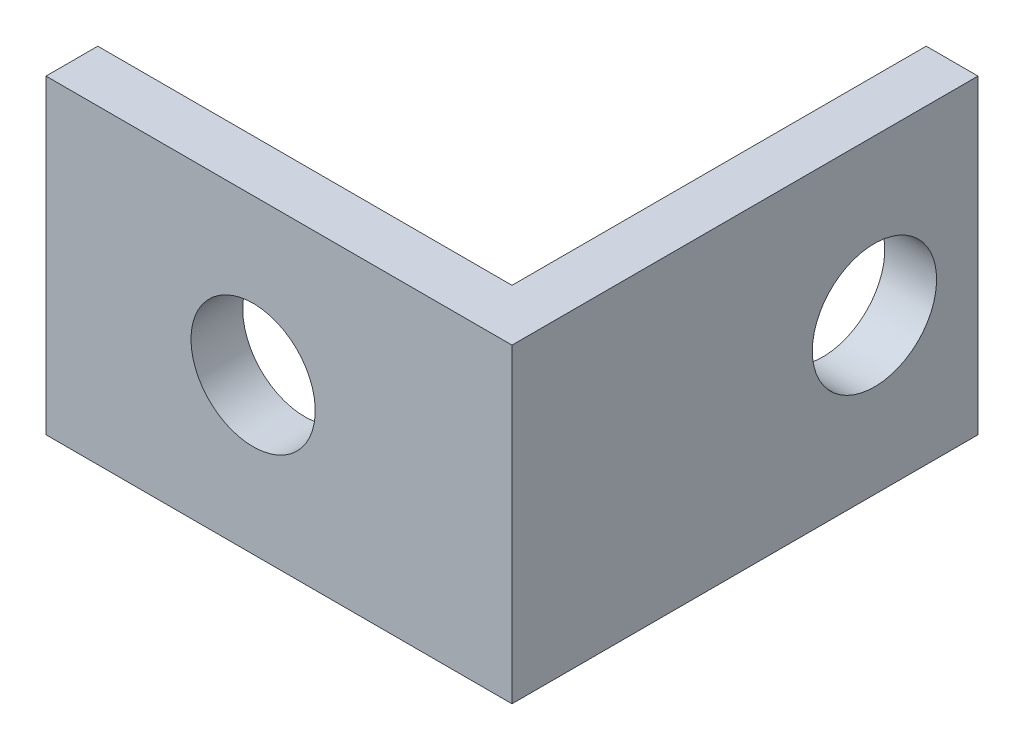
ISO-10303-21;
HEADER;
FILE_DESCRIPTION(('STEP AP214'),'2;1');
FILE_NAME('part.step','',(''),(''),'','','');
FILE_SCHEMA(('AUTOMOTIVE_DESIGN { 1 0 10303 214 1 1 1 1 }'));
ENDSEC;
DATA;
#1=APPLICATION_CONTEXT('core data for automotive mechanical design processes');
#2=APPLICATION_PROTOCOL_DEFINITION('international standard','automotive_design',2000,#1);
#3=PRODUCT_CONTEXT('',#1,'mechanical');
#4=PRODUCT('Part','Part','',(#3));
#5=PRODUCT_RELATED_PRODUCT_CATEGORY('part','',(#4));
#6=PRODUCT_DEFINITION_FORMATION('','',#4);
#7=PRODUCT_DEFINITION_CONTEXT('part definition',#1,'design');
#8=PRODUCT_DEFINITION('design','',#6,#7);
#9=PRODUCT_DEFINITION_SHAPE('','',#8);
#10=(LENGTH_UNIT() NAMED_UNIT(*) SI_UNIT(.MILLI.,.METRE.));
#11=(NAMED_UNIT(*) PLANE_ANGLE_UNIT() SI_UNIT($,.RADIAN.));
#12=(NAMED_UNIT(*) SI_UNIT($,.STERADIAN.) SOLID_ANGLE_UNIT());
#13=UNCERTAINTY_MEASURE_WITH_UNIT(LENGTH_MEASURE(1.E-05),#10,'distance_accuracy_value','');
#14=(GEOMETRIC_REPRESENTATION_CONTEXT(3) GLOBAL_UNCERTAINTY_ASSIGNED_CONTEXT((#13)) GLOBAL_UNIT_ASSIGNED_CONTEXT((#10,
#11,#12)) REPRESENTATION_CONTEXT('',''));
#15=CARTESIAN_POINT('',(0.,0.,0.));
#16=DIRECTION('',(0.,0.,1.));
#17=DIRECTION('',(1.,0.,0.));
#18=AXIS2_PLACEMENT_3D('',#15,#16,#17);
#19=CARTESIAN_POINT('',(0.,15.,-2.5));
#20=DIRECTION('',(1.,0.,0.));
#21=DIRECTION('',(0.,0.,-1.));
#22=AXIS2_PLACEMENT_3D('',#19,#20,#21);
#23=PLANE('',#22);
#24=DIRECTION('',(0.,0.,1.));
#25=VECTOR('',#24,1.);
#26=CARTESIAN_POINT('',(0.,0.,-2.5));
#27=LINE('',#26,#25);
#28=CARTESIAN_POINT('',(0.,0.,-2.5));
#29=VERTEX_POINT('',#28);
#30=CARTESIAN_POINT('',(0.,0.,0.));
#31=VERTEX_POINT('',#30);
#32=EDGE_CURVE('E128',#29,#31,#27,.T.);
#33=ORIENTED_EDGE('',*,*,#32,.T.);
#34=DIRECTION('',(0.,-1.,0.));
#35=VECTOR('',#34,1.);
#36=CARTESIAN_POINT('',(0.,15.,0.));
#37=LINE('',#36,#35);
#38=CARTESIAN_POINT('',(0.,15.,0.));
#39=VERTEX_POINT('',#38);
#40=EDGE_CURVE('E11',#39,#31,#37,.T.);
#41=ORIENTED_EDGE('',*,*,#40,.F.);
#42=DIRECTION('',(0.,0.,1.));
#43=VECTOR('',#42,1.);
#44=CARTESIAN_POINT('',(0.,15.,-2.5));
#45=LINE('',#44,#43);
#46=CARTESIAN_POINT('',(0.,15.,-2.5));
#47=VERTEX_POINT('',#46);
#48=EDGE_CURVE('E145',#47,#39,#45,.T.);
#49=ORIENTED_EDGE('',*,*,#48,.F.);
#50=DIRECTION('',(0.,-1.,0.));
#51=VECTOR('',#50,1.);
#52=CARTESIAN_POINT('',(0.,15.,-2.5));
#53=LINE('',#52,#51);
#54=EDGE_CURVE('E124',#47,#29,#53,.T.);
#55=ORIENTED_EDGE('',*,*,#54,.T.);
#56=EDGE_LOOP('',(#33,#41,#49,#55));
#57=FACE_BOUND('',#56,.T.);
#58=ADVANCED_FACE('F39',(#57),#23,.F.);
#59=CARTESIAN_POINT('',(0.,15.,0.));
#60=DIRECTION('',(0.,0.,-1.));
#61=DIRECTION('',(-1.,0.,0.));
#62=AXIS2_PLACEMENT_3D('',#59,#60,#61);
#63=PLANE('',#62);
#64=CARTESIAN_POINT('',(10.,7.5,0.));
#65=DIRECTION('',(0.,0.,-1.));
#66=DIRECTION('',(-1.,0.,0.));
#67=AXIS2_PLACEMENT_3D('',#64,#65,#66);
#68=CIRCLE('',#67,3.);
#69=CARTESIAN_POINT('',(7.,7.5,0.));
#70=VERTEX_POINT('',#69);
#71=EDGE_CURVE('E133',#70,#70,#68,.T.);
#72=ORIENTED_EDGE('',*,*,#71,.T.);
#73=EDGE_LOOP('',(#72));
#74=FACE_BOUND('',#73,.T.);
#75=DIRECTION('',(1.,0.,0.));
#76=VECTOR('',#75,1.);
#77=CARTESIAN_POINT('',(0.,0.,0.));
#78=LINE('',#77,#76);
#79=CARTESIAN_POINT('',(22.5,0.,0.));
#80=VERTEX_POINT('',#79);
#81=EDGE_CURVE('E132',#31,#80,#78,.T.);
#82=ORIENTED_EDGE('',*,*,#81,.T.);
#83=DIRECTION('',(0.,-1.,0.));
#84=VECTOR('',#83,1.);
#85=CARTESIAN_POINT('',(22.5,15.,0.));
#86=LINE('',#85,#84);
#87=CARTESIAN_POINT('',(22.5,15.,0.));
#88=VERTEX_POINT('',#87);
#89=EDGE_CURVE('E48',#88,#80,#86,.T.);
#90=ORIENTED_EDGE('',*,*,#89,.F.);
#91=DIRECTION('',(1.,0.,0.));
#92=VECTOR('',#91,1.);
#93=CARTESIAN_POINT('',(0.,15.,0.));
#94=LINE('',#93,#92);
#95=EDGE_CURVE('E93',#39,#88,#94,.T.);
#96=ORIENTED_EDGE('',*,*,#95,.F.);
#97=ORIENTED_EDGE('',*,*,#40,.T.);
#98=EDGE_LOOP('',(#82,#90,#96,#97));
#99=FACE_BOUND('',#98,.T.);
#100=ADVANCED_FACE('F176',(#74,#99),#63,.F.);
#101=CARTESIAN_POINT('',(22.5,15.,0.));
#102=DIRECTION('',(-1.,0.,0.));
#103=DIRECTION('',(0.,0.,1.));
#104=AXIS2_PLACEMENT_3D('',#101,#102,#103);
#105=PLANE('',#104);
#106=CARTESIAN_POINT('',(22.5,7.5,-17.5));
#107=DIRECTION('',(-1.,0.,0.));
#108=DIRECTION('',(0.,0.,1.));
#109=AXIS2_PLACEMENT_3D('',#106,#107,#108);
#110=CIRCLE('',#109,3.);
#111=CARTESIAN_POINT('',(22.5,7.5,-14.5));
#112=VERTEX_POINT('',#111);
#113=EDGE_CURVE('E257',#112,#112,#110,.T.);
#114=ORIENTED_EDGE('',*,*,#113,.T.);
#115=EDGE_LOOP('',(#114));
#116=FACE_BOUND('',#115,.T.);
#117=DIRECTION('',(0.,0.,-1.));
#118=VECTOR('',#117,1.);
#119=CARTESIAN_POINT('',(22.5,0.,0.));
#120=LINE('',#119,#118);
#121=CARTESIAN_POINT('',(22.5,0.,-22.5));
#122=VERTEX_POINT('',#121);
#123=EDGE_CURVE('E136',#80,#122,#120,.T.);
#124=ORIENTED_EDGE('',*,*,#123,.T.);
#125=DIRECTION('',(0.,-1.,0.));
#126=VECTOR('',#125,1.);
#127=CARTESIAN_POINT('',(22.5,15.,-22.5));
#128=LINE('',#127,#126);
#129=CARTESIAN_POINT('',(22.5,15.,-22.5));
#130=VERTEX_POINT('',#129);
#131=EDGE_CURVE('E117',#130,#122,#128,.T.);
#132=ORIENTED_EDGE('',*,*,#131,.F.);
#133=DIRECTION('',(0.,0.,-1.));
#134=VECTOR('',#133,1.);
#135=CARTESIAN_POINT('',(22.5,15.,0.));
#136=LINE('',#135,#134);
#137=EDGE_CURVE('E106',#88,#130,#136,.T.);
#138=ORIENTED_EDGE('',*,*,#137,.F.);
#139=ORIENTED_EDGE('',*,*,#89,.T.);
#140=EDGE_LOOP('',(#124,#132,#138,#139));
#141=FACE_BOUND('',#140,.T.);
#142=ADVANCED_FACE('F155',(#116,#141),#105,.F.);
#143=CARTESIAN_POINT('',(22.5,15.,-22.5));
#144=DIRECTION('',(0.,0.,1.));
#145=DIRECTION('',(1.,0.,0.));
#146=AXIS2_PLACEMENT_3D('',#143,#144,#145);
#147=PLANE('',#146);
#148=DIRECTION('',(-1.,0.,0.));
#149=VECTOR('',#148,1.);
#150=CARTESIAN_POINT('',(22.5,0.,-22.5));
#151=LINE('',#150,#149);
#152=CARTESIAN_POINT('',(20.,0.,-22.5));
#153=VERTEX_POINT('',#152);
#154=EDGE_CURVE('E115',#122,#153,#151,.T.);
#155=ORIENTED_EDGE('',*,*,#154,.T.);
#156=DIRECTION('',(0.,-1.,0.));
#157=VECTOR('',#156,1.);
#158=CARTESIAN_POINT('',(20.,15.,-22.5));
#159=LINE('',#158,#157);
#160=CARTESIAN_POINT('',(20.,15.,-22.5));
#161=VERTEX_POINT('',#160);
#162=EDGE_CURVE('E112',#161,#153,#159,.T.);
#163=ORIENTED_EDGE('',*,*,#162,.F.);
#164=DIRECTION('',(-1.,0.,0.));
#165=VECTOR('',#164,1.);
#166=CARTESIAN_POINT('',(22.5,15.,-22.5));
#167=LINE('',#166,#165);
#168=EDGE_CURVE('E100',#130,#161,#167,.T.);
#169=ORIENTED_EDGE('',*,*,#168,.F.);
#170=ORIENTED_EDGE('',*,*,#131,.T.);
#171=EDGE_LOOP('',(#155,#163,#169,#170));
#172=FACE_BOUND('',#171,.T.);
#173=ADVANCED_FACE('F113',(#172),#147,.F.);
#174=CARTESIAN_POINT('',(20.,15.,-22.5));
#175=DIRECTION('',(1.,0.,0.));
#176=DIRECTION('',(0.,0.,-1.));
#177=AXIS2_PLACEMENT_3D('',#174,#175,#176);
#178=PLANE('',#177);
#179=CARTESIAN_POINT('',(20.,7.5,-17.5));
#180=DIRECTION('',(-1.,0.,0.));
#181=DIRECTION('',(0.,0.,1.));
#182=AXIS2_PLACEMENT_3D('',#179,#180,#181);
#183=CIRCLE('',#182,3.);
#184=CARTESIAN_POINT('',(20.,7.5,-14.5));
#185=VERTEX_POINT('',#184);
#186=EDGE_CURVE('E263',#185,#185,#183,.T.);
#187=ORIENTED_EDGE('',*,*,#186,.F.);
#188=EDGE_LOOP('',(#187));
#189=FACE_BOUND('',#188,.T.);
#190=DIRECTION('',(0.,0.,1.));
#191=VECTOR('',#190,1.);
#192=CARTESIAN_POINT('',(20.,0.,-22.5));
#193=LINE('',#192,#191);
#194=CARTESIAN_POINT('',(20.,0.,-2.5));
#195=VERTEX_POINT('',#194);
#196=EDGE_CURVE('E79',#153,#195,#193,.T.);
#197=ORIENTED_EDGE('',*,*,#196,.T.);
#198=DIRECTION('',(0.,-1.,0.));
#199=VECTOR('',#198,1.);
#200=CARTESIAN_POINT('',(20.,15.,-2.5));
#201=LINE('',#200,#199);
#202=CARTESIAN_POINT('',(20.,15.,-2.5));
#203=VERTEX_POINT('',#202);
#204=EDGE_CURVE('E118',#203,#195,#201,.T.);
#205=ORIENTED_EDGE('',*,*,#204,.F.);
#206=DIRECTION('',(0.,0.,1.));
#207=VECTOR('',#206,1.);
#208=CARTESIAN_POINT('',(20.,15.,-22.5));
#209=LINE('',#208,#207);
#210=EDGE_CURVE('E104',#161,#203,#209,.T.);
#211=ORIENTED_EDGE('',*,*,#210,.F.);
#212=ORIENTED_EDGE('',*,*,#162,.T.);
#213=EDGE_LOOP('',(#197,#205,#211,#212));
#214=FACE_BOUND('',#213,.T.);
#215=ADVANCED_FACE('F120',(#189,#214),#178,.F.);
#216=CARTESIAN_POINT('',(20.,15.,-2.5));
#217=DIRECTION('',(0.,0.,1.));
#218=DIRECTION('',(1.,0.,0.));
#219=AXIS2_PLACEMENT_3D('',#216,#217,#218);
#220=PLANE('',#219);
#221=CARTESIAN_POINT('',(10.,7.5,-2.5));
#222=DIRECTION('',(0.,0.,-1.));
#223=DIRECTION('',(-1.,0.,0.));
#224=AXIS2_PLACEMENT_3D('',#221,#222,#223);
#225=CIRCLE('',#224,3.);
#226=CARTESIAN_POINT('',(7.,7.5,-2.5));
#227=VERTEX_POINT('',#226);
#228=EDGE_CURVE('E255',#227,#227,#225,.T.);
#229=ORIENTED_EDGE('',*,*,#228,.F.);
#230=EDGE_LOOP('',(#229));
#231=FACE_BOUND('',#230,.T.);
#232=DIRECTION('',(-1.,0.,0.));
#233=VECTOR('',#232,1.);
#234=CARTESIAN_POINT('',(20.,0.,-2.5));
#235=LINE('',#234,#233);
#236=EDGE_CURVE('E85',#195,#29,#235,.T.);
#237=ORIENTED_EDGE('',*,*,#236,.T.);
#238=ORIENTED_EDGE('',*,*,#54,.F.);
#239=DIRECTION('',(-1.,0.,0.));
#240=VECTOR('',#239,1.);
#241=CARTESIAN_POINT('',(20.,15.,-2.5));
#242=LINE('',#241,#240);
#243=EDGE_CURVE('E56',#203,#47,#242,.T.);
#244=ORIENTED_EDGE('',*,*,#243,.F.);
#245=ORIENTED_EDGE('',*,*,#204,.T.);
#246=EDGE_LOOP('',(#237,#238,#244,#245));
#247=FACE_BOUND('',#246,.T.);
#248=ADVANCED_FACE('F162',(#231,#247),#220,.F.);
#249=CARTESIAN_POINT('',(0.,15.,0.));
#250=DIRECTION('',(0.,1.,0.));
#251=DIRECTION('',(0.,0.,1.));
#252=AXIS2_PLACEMENT_3D('',#249,#250,#251);
#253=PLANE('',#252);
#254=ORIENTED_EDGE('',*,*,#48,.T.);
#255=ORIENTED_EDGE('',*,*,#95,.T.);
#256=ORIENTED_EDGE('',*,*,#137,.T.);
#257=ORIENTED_EDGE('',*,*,#168,.T.);
#258=ORIENTED_EDGE('',*,*,#210,.T.);
#259=ORIENTED_EDGE('',*,*,#243,.T.);
#260=EDGE_LOOP('',(#254,#255,#256,#257,#258,#259));
#261=FACE_BOUND('',#260,.T.);
#262=ADVANCED_FACE('F102',(#261),#253,.T.);
#263=CARTESIAN_POINT('',(0.,0.,0.));
#264=DIRECTION('',(0.,1.,0.));
#265=DIRECTION('',(0.,0.,1.));
#266=AXIS2_PLACEMENT_3D('',#263,#264,#265);
#267=PLANE('',#266);
#268=ORIENTED_EDGE('',*,*,#32,.F.);
#269=ORIENTED_EDGE('',*,*,#236,.F.);
#270=ORIENTED_EDGE('',*,*,#196,.F.);
#271=ORIENTED_EDGE('',*,*,#154,.F.);
#272=ORIENTED_EDGE('',*,*,#123,.F.);
#273=ORIENTED_EDGE('',*,*,#81,.F.);
#274=EDGE_LOOP('',(#268,#269,#270,#271,#272,#273));
#275=FACE_BOUND('',#274,.T.);
#276=ADVANCED_FACE('F158',(#275),#267,.F.);
#277=CARTESIAN_POINT('',(10.,7.5,0.));
#278=DIRECTION('',(0.,0.,-1.));
#279=DIRECTION('',(-1.,0.,0.));
#280=AXIS2_PLACEMENT_3D('',#277,#278,#279);
#281=CYLINDRICAL_SURFACE('',#280,3.);
#282=ORIENTED_EDGE('',*,*,#71,.F.);
#283=EDGE_LOOP('',(#282));
#284=FACE_BOUND('',#283,.T.);
#285=ORIENTED_EDGE('',*,*,#228,.T.);
#286=EDGE_LOOP('',(#285));
#287=FACE_BOUND('',#286,.T.);
#288=ADVANCED_FACE('F211',(#284,#287),#281,.F.);
#289=CARTESIAN_POINT('',(22.5,7.5,-17.5));
#290=DIRECTION('',(-1.,0.,0.));
#291=DIRECTION('',(0.,0.,1.));
#292=AXIS2_PLACEMENT_3D('',#289,#290,#291);
#293=CYLINDRICAL_SURFACE('',#292,3.);
#294=ORIENTED_EDGE('',*,*,#113,.F.);
#295=EDGE_LOOP('',(#294));
#296=FACE_BOUND('',#295,.T.);
#297=ORIENTED_EDGE('',*,*,#186,.T.);
#298=EDGE_LOOP('',(#297));
#299=FACE_BOUND('',#298,.T.);
#300=ADVANCED_FACE('F207',(#296,#299),#293,.F.);
#301=CLOSED_SHELL('',(#58,#100,#142,#173,#215,#248,#262,#276,#288,#300));
#302=MANIFOLD_SOLID_BREP('B2',#301);
#303=ADVANCED_BREP_SHAPE_REPRESENTATION('',(#18,#302),#14);
#304=SHAPE_DEFINITION_REPRESENTATION(#9,#303);
ENDSEC;
END-ISO-10303-21;
